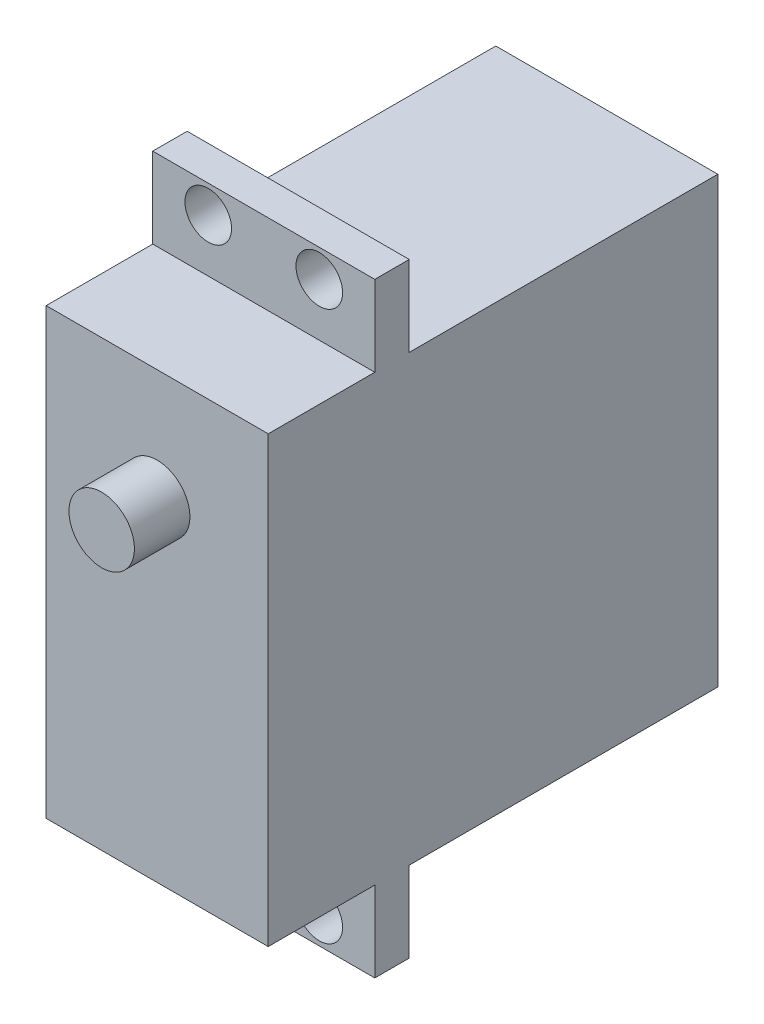
ISO-10303-21;
HEADER;
FILE_DESCRIPTION(('STEP AP214'),'2;1');
FILE_NAME('part.step','',(''),(''),'','','');
FILE_SCHEMA(('AUTOMOTIVE_DESIGN { 1 0 10303 214 1 1 1 1 }'));
ENDSEC;
DATA;
#1=APPLICATION_CONTEXT('core data for automotive mechanical design processes');
#2=APPLICATION_PROTOCOL_DEFINITION('international standard','automotive_design',2000,#1);
#3=PRODUCT_CONTEXT('',#1,'mechanical');
#4=PRODUCT('Part','Part','',(#3));
#5=PRODUCT_RELATED_PRODUCT_CATEGORY('part','',(#4));
#6=PRODUCT_DEFINITION_FORMATION('','',#4);
#7=PRODUCT_DEFINITION_CONTEXT('part definition',#1,'design');
#8=PRODUCT_DEFINITION('design','',#6,#7);
#9=PRODUCT_DEFINITION_SHAPE('','',#8);
#10=(LENGTH_UNIT() NAMED_UNIT(*) SI_UNIT(.MILLI.,.METRE.));
#11=(NAMED_UNIT(*) PLANE_ANGLE_UNIT() SI_UNIT($,.RADIAN.));
#12=(NAMED_UNIT(*) SI_UNIT($,.STERADIAN.) SOLID_ANGLE_UNIT());
#13=UNCERTAINTY_MEASURE_WITH_UNIT(LENGTH_MEASURE(1.E-05),#10,'distance_accuracy_value','');
#14=(GEOMETRIC_REPRESENTATION_CONTEXT(3) GLOBAL_UNCERTAINTY_ASSIGNED_CONTEXT((#13)) GLOBAL_UNIT_ASSIGNED_CONTEXT((#10,
#11,#12)) REPRESENTATION_CONTEXT('',''));
#15=CARTESIAN_POINT('',(0.,0.,0.));
#16=DIRECTION('',(0.,0.,1.));
#17=DIRECTION('',(1.,0.,0.));
#18=AXIS2_PLACEMENT_3D('',#15,#16,#17);
#19=CARTESIAN_POINT('',(10.,20.,20.25));
#20=DIRECTION('',(0.,-1.,0.));
#21=DIRECTION('',(0.,0.,-1.));
#22=AXIS2_PLACEMENT_3D('',#19,#20,#21);
#23=PLANE('',#22);
#24=DIRECTION('',(0.,0.,1.));
#25=VECTOR('',#24,1.);
#26=CARTESIAN_POINT('',(-10.,20.,20.25));
#27=LINE('',#26,#25);
#28=CARTESIAN_POINT('',(-10.,20.,-20.25));
#29=VERTEX_POINT('',#28);
#30=CARTESIAN_POINT('',(-10.,20.,7.55));
#31=VERTEX_POINT('',#30);
#32=EDGE_CURVE('E219',#29,#31,#27,.T.);
#33=ORIENTED_EDGE('',*,*,#32,.T.);
#34=DIRECTION('',(1.,0.,0.));
#35=VECTOR('',#34,1.);
#36=CARTESIAN_POINT('',(-10.,20.,7.55));
#37=LINE('',#36,#35);
#38=CARTESIAN_POINT('',(10.,20.,7.55));
#39=VERTEX_POINT('',#38);
#40=EDGE_CURVE('E152',#31,#39,#37,.T.);
#41=ORIENTED_EDGE('',*,*,#40,.T.);
#42=DIRECTION('',(0.,0.,1.));
#43=VECTOR('',#42,1.);
#44=CARTESIAN_POINT('',(10.,20.,20.25));
#45=LINE('',#44,#43);
#46=CARTESIAN_POINT('',(10.,20.,-20.25));
#47=VERTEX_POINT('',#46);
#48=EDGE_CURVE('E208',#47,#39,#45,.T.);
#49=ORIENTED_EDGE('',*,*,#48,.F.);
#50=DIRECTION('',(-1.,0.,0.));
#51=VECTOR('',#50,1.);
#52=CARTESIAN_POINT('',(10.,20.,-20.25));
#53=LINE('',#52,#51);
#54=EDGE_CURVE('E218',#47,#29,#53,.T.);
#55=ORIENTED_EDGE('',*,*,#54,.T.);
#56=EDGE_LOOP('',(#33,#41,#49,#55));
#57=FACE_BOUND('',#56,.T.);
#58=ADVANCED_FACE('F43',(#57),#23,.F.);
#59=CARTESIAN_POINT('',(10.,-20.,20.25));
#60=DIRECTION('',(0.,1.,0.));
#61=DIRECTION('',(0.,0.,1.));
#62=AXIS2_PLACEMENT_3D('',#59,#60,#61);
#63=PLANE('',#62);
#64=DIRECTION('',(-1.,0.,0.));
#65=VECTOR('',#64,1.);
#66=CARTESIAN_POINT('',(-10.,-20.,10.65));
#67=LINE('',#66,#65);
#68=CARTESIAN_POINT('',(10.,-20.,10.65));
#69=VERTEX_POINT('',#68);
#70=CARTESIAN_POINT('',(-10.,-20.,10.65));
#71=VERTEX_POINT('',#70);
#72=EDGE_CURVE('E68',#69,#71,#67,.T.);
#73=ORIENTED_EDGE('',*,*,#72,.F.);
#74=DIRECTION('',(0.,0.,-1.));
#75=VECTOR('',#74,1.);
#76=CARTESIAN_POINT('',(10.,-20.,20.25));
#77=LINE('',#76,#75);
#78=CARTESIAN_POINT('',(10.,-20.,20.25));
#79=VERTEX_POINT('',#78);
#80=EDGE_CURVE('E214',#79,#69,#77,.T.);
#81=ORIENTED_EDGE('',*,*,#80,.F.);
#82=DIRECTION('',(-1.,0.,0.));
#83=VECTOR('',#82,1.);
#84=CARTESIAN_POINT('',(10.,-20.,20.25));
#85=LINE('',#84,#83);
#86=CARTESIAN_POINT('',(-10.,-20.,20.25));
#87=VERTEX_POINT('',#86);
#88=EDGE_CURVE('E234',#79,#87,#85,.T.);
#89=ORIENTED_EDGE('',*,*,#88,.T.);
#90=DIRECTION('',(0.,0.,-1.));
#91=VECTOR('',#90,1.);
#92=CARTESIAN_POINT('',(-10.,-20.,20.25));
#93=LINE('',#92,#91);
#94=EDGE_CURVE('E226',#87,#71,#93,.T.);
#95=ORIENTED_EDGE('',*,*,#94,.T.);
#96=EDGE_LOOP('',(#73,#81,#89,#95));
#97=FACE_BOUND('',#96,.T.);
#98=ADVANCED_FACE('F272',(#97),#63,.F.);
#99=DIRECTION('',(1.,0.,0.));
#100=VECTOR('',#99,1.);
#101=CARTESIAN_POINT('',(-10.,-20.,7.55));
#102=LINE('',#101,#100);
#103=CARTESIAN_POINT('',(-10.,-20.,7.55));
#104=VERTEX_POINT('',#103);
#105=CARTESIAN_POINT('',(10.,-20.,7.55));
#106=VERTEX_POINT('',#105);
#107=EDGE_CURVE('E181',#104,#106,#102,.T.);
#108=ORIENTED_EDGE('',*,*,#107,.F.);
#109=CARTESIAN_POINT('',(-10.,-20.,-20.25));
#110=VERTEX_POINT('',#109);
#111=EDGE_CURVE('E223',#104,#110,#93,.T.);
#112=ORIENTED_EDGE('',*,*,#111,.T.);
#113=DIRECTION('',(-1.,0.,0.));
#114=VECTOR('',#113,1.);
#115=CARTESIAN_POINT('',(10.,-20.,-20.25));
#116=LINE('',#115,#114);
#117=CARTESIAN_POINT('',(10.,-20.,-20.25));
#118=VERTEX_POINT('',#117);
#119=EDGE_CURVE('E235',#118,#110,#116,.T.);
#120=ORIENTED_EDGE('',*,*,#119,.F.);
#121=EDGE_CURVE('E212',#106,#118,#77,.T.);
#122=ORIENTED_EDGE('',*,*,#121,.F.);
#123=EDGE_LOOP('',(#108,#112,#120,#122));
#124=FACE_BOUND('',#123,.T.);
#125=ADVANCED_FACE('F290',(#124),#63,.F.);
#126=CARTESIAN_POINT('',(10.,20.,10.65));
#127=VERTEX_POINT('',#126);
#128=CARTESIAN_POINT('',(10.,20.,20.25));
#129=VERTEX_POINT('',#128);
#130=EDGE_CURVE('E215',#127,#129,#45,.T.);
#131=ORIENTED_EDGE('',*,*,#130,.F.);
#132=DIRECTION('',(-1.,0.,0.));
#133=VECTOR('',#132,1.);
#134=CARTESIAN_POINT('',(-10.,20.,10.65));
#135=LINE('',#134,#133);
#136=CARTESIAN_POINT('',(-10.,20.,10.65));
#137=VERTEX_POINT('',#136);
#138=EDGE_CURVE('E163',#127,#137,#135,.T.);
#139=ORIENTED_EDGE('',*,*,#138,.T.);
#140=CARTESIAN_POINT('',(-10.,20.,20.25));
#141=VERTEX_POINT('',#140);
#142=EDGE_CURVE('E142',#137,#141,#27,.T.);
#143=ORIENTED_EDGE('',*,*,#142,.T.);
#144=DIRECTION('',(-1.,0.,0.));
#145=VECTOR('',#144,1.);
#146=CARTESIAN_POINT('',(10.,20.,20.25));
#147=LINE('',#146,#145);
#148=EDGE_CURVE('E55',#129,#141,#147,.T.);
#149=ORIENTED_EDGE('',*,*,#148,.F.);
#150=EDGE_LOOP('',(#131,#139,#143,#149));
#151=FACE_BOUND('',#150,.T.);
#152=ADVANCED_FACE('F44',(#151),#23,.F.);
#153=CARTESIAN_POINT('',(10.,-20.,20.25));
#154=DIRECTION('',(0.,0.,-1.));
#155=DIRECTION('',(-1.,0.,0.));
#156=AXIS2_PLACEMENT_3D('',#153,#154,#155);
#157=PLANE('',#156);
#158=CARTESIAN_POINT('',(0.,10.,20.25));
#159=DIRECTION('',(0.,0.,1.));
#160=DIRECTION('',(1.,0.,0.));
#161=AXIS2_PLACEMENT_3D('',#158,#159,#160);
#162=CIRCLE('',#161,2.95);
#163=CARTESIAN_POINT('',(2.95,10.,20.25));
#164=VERTEX_POINT('',#163);
#165=EDGE_CURVE('E11',#164,#164,#162,.T.);
#166=ORIENTED_EDGE('',*,*,#165,.F.);
#167=EDGE_LOOP('',(#166));
#168=FACE_BOUND('',#167,.T.);
#169=DIRECTION('',(0.,-1.,0.));
#170=VECTOR('',#169,1.);
#171=CARTESIAN_POINT('',(-10.,-20.,20.25));
#172=LINE('',#171,#170);
#173=EDGE_CURVE('E224',#141,#87,#172,.T.);
#174=ORIENTED_EDGE('',*,*,#173,.T.);
#175=ORIENTED_EDGE('',*,*,#88,.F.);
#176=DIRECTION('',(0.,-1.,0.));
#177=VECTOR('',#176,1.);
#178=CARTESIAN_POINT('',(10.,-20.,20.25));
#179=LINE('',#178,#177);
#180=EDGE_CURVE('E211',#129,#79,#179,.T.);
#181=ORIENTED_EDGE('',*,*,#180,.F.);
#182=ORIENTED_EDGE('',*,*,#148,.T.);
#183=EDGE_LOOP('',(#174,#175,#181,#182));
#184=FACE_BOUND('',#183,.T.);
#185=ADVANCED_FACE('F264',(#168,#184),#157,.F.);
#186=CARTESIAN_POINT('',(10.,-20.,-20.25));
#187=DIRECTION('',(0.,0.,1.));
#188=DIRECTION('',(1.,0.,0.));
#189=AXIS2_PLACEMENT_3D('',#186,#187,#188);
#190=PLANE('',#189);
#191=DIRECTION('',(0.,1.,0.));
#192=VECTOR('',#191,1.);
#193=CARTESIAN_POINT('',(-10.,-20.,-20.25));
#194=LINE('',#193,#192);
#195=EDGE_CURVE('E227',#110,#29,#194,.T.);
#196=ORIENTED_EDGE('',*,*,#195,.T.);
#197=ORIENTED_EDGE('',*,*,#54,.F.);
#198=DIRECTION('',(0.,1.,0.));
#199=VECTOR('',#198,1.);
#200=CARTESIAN_POINT('',(10.,-20.,-20.25));
#201=LINE('',#200,#199);
#202=EDGE_CURVE('E220',#118,#47,#201,.T.);
#203=ORIENTED_EDGE('',*,*,#202,.F.);
#204=ORIENTED_EDGE('',*,*,#119,.T.);
#205=EDGE_LOOP('',(#196,#197,#203,#204));
#206=FACE_BOUND('',#205,.T.);
#207=ADVANCED_FACE('F268',(#206),#190,.F.);
#208=CARTESIAN_POINT('',(10.,0.,0.));
#209=DIRECTION('',(1.,0.,0.));
#210=DIRECTION('',(0.,0.,-1.));
#211=AXIS2_PLACEMENT_3D('',#208,#209,#210);
#212=PLANE('',#211);
#213=ORIENTED_EDGE('',*,*,#48,.T.);
#214=DIRECTION('',(0.,-1.,0.));
#215=VECTOR('',#214,1.);
#216=CARTESIAN_POINT('',(10.,27.25,7.55));
#217=LINE('',#216,#215);
#218=CARTESIAN_POINT('',(10.,27.25,7.55));
#219=VERTEX_POINT('',#218);
#220=EDGE_CURVE('E166',#219,#39,#217,.T.);
#221=ORIENTED_EDGE('',*,*,#220,.F.);
#222=DIRECTION('',(0.,0.,1.));
#223=VECTOR('',#222,1.);
#224=CARTESIAN_POINT('',(10.,27.25,10.65));
#225=LINE('',#224,#223);
#226=CARTESIAN_POINT('',(10.,27.25,10.65));
#227=VERTEX_POINT('',#226);
#228=EDGE_CURVE('E160',#219,#227,#225,.T.);
#229=ORIENTED_EDGE('',*,*,#228,.T.);
#230=DIRECTION('',(0.,-1.,0.));
#231=VECTOR('',#230,1.);
#232=CARTESIAN_POINT('',(10.,27.25,10.65));
#233=LINE('',#232,#231);
#234=EDGE_CURVE('E145',#227,#127,#233,.T.);
#235=ORIENTED_EDGE('',*,*,#234,.T.);
#236=ORIENTED_EDGE('',*,*,#130,.T.);
#237=ORIENTED_EDGE('',*,*,#180,.T.);
#238=ORIENTED_EDGE('',*,*,#80,.T.);
#239=DIRECTION('',(0.,1.,0.));
#240=VECTOR('',#239,1.);
#241=CARTESIAN_POINT('',(10.,-27.25,10.65));
#242=LINE('',#241,#240);
#243=CARTESIAN_POINT('',(10.,-27.25,10.65));
#244=VERTEX_POINT('',#243);
#245=EDGE_CURVE('E200',#244,#69,#242,.T.);
#246=ORIENTED_EDGE('',*,*,#245,.F.);
#247=DIRECTION('',(0.,0.,1.));
#248=VECTOR('',#247,1.);
#249=CARTESIAN_POINT('',(10.,-27.25,10.65));
#250=LINE('',#249,#248);
#251=CARTESIAN_POINT('',(10.,-27.25,7.55));
#252=VERTEX_POINT('',#251);
#253=EDGE_CURVE('E188',#252,#244,#250,.T.);
#254=ORIENTED_EDGE('',*,*,#253,.F.);
#255=DIRECTION('',(0.,1.,0.));
#256=VECTOR('',#255,1.);
#257=CARTESIAN_POINT('',(10.,-27.25,7.55));
#258=LINE('',#257,#256);
#259=EDGE_CURVE('E205',#252,#106,#258,.T.);
#260=ORIENTED_EDGE('',*,*,#259,.T.);
#261=ORIENTED_EDGE('',*,*,#121,.T.);
#262=ORIENTED_EDGE('',*,*,#202,.T.);
#263=EDGE_LOOP('',(#213,#221,#229,#235,#236,#237,#238,#246,#254,#260,#261,#262));
#264=FACE_BOUND('',#263,.T.);
#265=ADVANCED_FACE('F282',(#264),#212,.T.);
#266=CARTESIAN_POINT('',(-10.,0.,0.));
#267=DIRECTION('',(1.,0.,0.));
#268=DIRECTION('',(0.,0.,-1.));
#269=AXIS2_PLACEMENT_3D('',#266,#267,#268);
#270=PLANE('',#269);
#271=ORIENTED_EDGE('',*,*,#32,.F.);
#272=ORIENTED_EDGE('',*,*,#195,.F.);
#273=ORIENTED_EDGE('',*,*,#111,.F.);
#274=DIRECTION('',(0.,1.,0.));
#275=VECTOR('',#274,1.);
#276=CARTESIAN_POINT('',(-10.,-27.25,7.55));
#277=LINE('',#276,#275);
#278=CARTESIAN_POINT('',(-10.,-27.25,7.55));
#279=VERTEX_POINT('',#278);
#280=EDGE_CURVE('E202',#279,#104,#277,.T.);
#281=ORIENTED_EDGE('',*,*,#280,.F.);
#282=DIRECTION('',(0.,0.,-1.));
#283=VECTOR('',#282,1.);
#284=CARTESIAN_POINT('',(-10.,-27.25,10.65));
#285=LINE('',#284,#283);
#286=CARTESIAN_POINT('',(-10.,-27.25,10.65));
#287=VERTEX_POINT('',#286);
#288=EDGE_CURVE('E184',#287,#279,#285,.T.);
#289=ORIENTED_EDGE('',*,*,#288,.F.);
#290=DIRECTION('',(0.,1.,0.));
#291=VECTOR('',#290,1.);
#292=CARTESIAN_POINT('',(-10.,-27.25,10.65));
#293=LINE('',#292,#291);
#294=EDGE_CURVE('E193',#287,#71,#293,.T.);
#295=ORIENTED_EDGE('',*,*,#294,.T.);
#296=ORIENTED_EDGE('',*,*,#94,.F.);
#297=ORIENTED_EDGE('',*,*,#173,.F.);
#298=ORIENTED_EDGE('',*,*,#142,.F.);
#299=DIRECTION('',(0.,-1.,0.));
#300=VECTOR('',#299,1.);
#301=CARTESIAN_POINT('',(-10.,27.25,10.65));
#302=LINE('',#301,#300);
#303=CARTESIAN_POINT('',(-10.,27.25,10.65));
#304=VERTEX_POINT('',#303);
#305=EDGE_CURVE('E58',#304,#137,#302,.T.);
#306=ORIENTED_EDGE('',*,*,#305,.F.);
#307=DIRECTION('',(0.,0.,-1.));
#308=VECTOR('',#307,1.);
#309=CARTESIAN_POINT('',(-10.,27.25,10.65));
#310=LINE('',#309,#308);
#311=CARTESIAN_POINT('',(-10.,27.25,7.55));
#312=VERTEX_POINT('',#311);
#313=EDGE_CURVE('E137',#304,#312,#310,.T.);
#314=ORIENTED_EDGE('',*,*,#313,.T.);
#315=DIRECTION('',(0.,-1.,0.));
#316=VECTOR('',#315,1.);
#317=CARTESIAN_POINT('',(-10.,27.25,7.55));
#318=LINE('',#317,#316);
#319=EDGE_CURVE('E162',#312,#31,#318,.T.);
#320=ORIENTED_EDGE('',*,*,#319,.T.);
#321=EDGE_LOOP('',(#271,#272,#273,#281,#289,#295,#296,#297,#298,#306,#314,#320));
#322=FACE_BOUND('',#321,.T.);
#323=ADVANCED_FACE('F138',(#322),#270,.F.);
#324=CARTESIAN_POINT('',(-10.,-27.25,7.55));
#325=DIRECTION('',(0.,0.,1.));
#326=DIRECTION('',(0.,-1.,0.));
#327=AXIS2_PLACEMENT_3D('',#324,#325,#326);
#328=PLANE('',#327);
#329=CARTESIAN_POINT('',(-5.,-24.75,7.55));
#330=DIRECTION('',(0.,0.,1.));
#331=DIRECTION('',(0.,-1.,0.));
#332=AXIS2_PLACEMENT_3D('',#329,#330,#331);
#333=CIRCLE('',#332,2.1);
#334=CARTESIAN_POINT('',(-5.,-26.85,7.55));
#335=VERTEX_POINT('',#334);
#336=EDGE_CURVE('E179',#335,#335,#333,.T.);
#337=ORIENTED_EDGE('',*,*,#336,.T.);
#338=EDGE_LOOP('',(#337));
#339=FACE_BOUND('',#338,.T.);
#340=CARTESIAN_POINT('',(5.,-24.75,7.55));
#341=DIRECTION('',(0.,0.,1.));
#342=DIRECTION('',(0.,-1.,0.));
#343=AXIS2_PLACEMENT_3D('',#340,#341,#342);
#344=CIRCLE('',#343,2.1);
#345=CARTESIAN_POINT('',(5.,-26.85,7.55));
#346=VERTEX_POINT('',#345);
#347=EDGE_CURVE('E174',#346,#346,#344,.T.);
#348=ORIENTED_EDGE('',*,*,#347,.T.);
#349=EDGE_LOOP('',(#348));
#350=FACE_BOUND('',#349,.T.);
#351=ORIENTED_EDGE('',*,*,#107,.T.);
#352=ORIENTED_EDGE('',*,*,#259,.F.);
#353=DIRECTION('',(1.,0.,0.));
#354=VECTOR('',#353,1.);
#355=CARTESIAN_POINT('',(-10.,-27.25,7.55));
#356=LINE('',#355,#354);
#357=EDGE_CURVE('E190',#279,#252,#356,.T.);
#358=ORIENTED_EDGE('',*,*,#357,.F.);
#359=ORIENTED_EDGE('',*,*,#280,.T.);
#360=EDGE_LOOP('',(#351,#352,#358,#359));
#361=FACE_BOUND('',#360,.T.);
#362=ADVANCED_FACE('F313',(#339,#350,#361),#328,.F.);
#363=CARTESIAN_POINT('',(-10.,-27.25,10.65));
#364=DIRECTION('',(0.,0.,-1.));
#365=DIRECTION('',(0.,1.,0.));
#366=AXIS2_PLACEMENT_3D('',#363,#364,#365);
#367=PLANE('',#366);
#368=CARTESIAN_POINT('',(-5.,-24.75,10.65));
#369=DIRECTION('',(0.,0.,1.));
#370=DIRECTION('',(1.,0.,0.));
#371=AXIS2_PLACEMENT_3D('',#368,#369,#370);
#372=CIRCLE('',#371,2.1);
#373=CARTESIAN_POINT('',(-2.9,-24.75,10.65));
#374=VERTEX_POINT('',#373);
#375=EDGE_CURVE('E175',#374,#374,#372,.T.);
#376=ORIENTED_EDGE('',*,*,#375,.F.);
#377=EDGE_LOOP('',(#376));
#378=FACE_BOUND('',#377,.T.);
#379=CARTESIAN_POINT('',(5.,-24.75,10.65));
#380=DIRECTION('',(0.,0.,1.));
#381=DIRECTION('',(1.,0.,0.));
#382=AXIS2_PLACEMENT_3D('',#379,#380,#381);
#383=CIRCLE('',#382,2.1);
#384=CARTESIAN_POINT('',(7.1,-24.75,10.65));
#385=VERTEX_POINT('',#384);
#386=EDGE_CURVE('E141',#385,#385,#383,.T.);
#387=ORIENTED_EDGE('',*,*,#386,.F.);
#388=EDGE_LOOP('',(#387));
#389=FACE_BOUND('',#388,.T.);
#390=ORIENTED_EDGE('',*,*,#72,.T.);
#391=ORIENTED_EDGE('',*,*,#294,.F.);
#392=DIRECTION('',(-1.,0.,0.));
#393=VECTOR('',#392,1.);
#394=CARTESIAN_POINT('',(-10.,-27.25,10.65));
#395=LINE('',#394,#393);
#396=EDGE_CURVE('E191',#244,#287,#395,.T.);
#397=ORIENTED_EDGE('',*,*,#396,.F.);
#398=ORIENTED_EDGE('',*,*,#245,.T.);
#399=EDGE_LOOP('',(#390,#391,#397,#398));
#400=FACE_BOUND('',#399,.T.);
#401=ADVANCED_FACE('F276',(#378,#389,#400),#367,.F.);
#402=CARTESIAN_POINT('',(0.,-27.25,0.));
#403=DIRECTION('',(0.,-1.,0.));
#404=DIRECTION('',(0.,0.,-1.));
#405=AXIS2_PLACEMENT_3D('',#402,#403,#404);
#406=PLANE('',#405);
#407=ORIENTED_EDGE('',*,*,#288,.T.);
#408=ORIENTED_EDGE('',*,*,#357,.T.);
#409=ORIENTED_EDGE('',*,*,#253,.T.);
#410=ORIENTED_EDGE('',*,*,#396,.T.);
#411=EDGE_LOOP('',(#407,#408,#409,#410));
#412=FACE_BOUND('',#411,.T.);
#413=ADVANCED_FACE('F314',(#412),#406,.T.);
#414=CARTESIAN_POINT('',(5.,-24.75,-20.25));
#415=DIRECTION('',(0.,0.,1.));
#416=DIRECTION('',(1.,0.,0.));
#417=AXIS2_PLACEMENT_3D('',#414,#415,#416);
#418=CYLINDRICAL_SURFACE('',#417,2.1);
#419=ORIENTED_EDGE('',*,*,#386,.T.);
#420=EDGE_LOOP('',(#419));
#421=FACE_BOUND('',#420,.T.);
#422=ORIENTED_EDGE('',*,*,#347,.F.);
#423=EDGE_LOOP('',(#422));
#424=FACE_BOUND('',#423,.T.);
#425=ADVANCED_FACE('F316',(#421,#424),#418,.F.);
#426=CARTESIAN_POINT('',(-5.,-24.75,-20.25));
#427=DIRECTION('',(0.,0.,1.));
#428=DIRECTION('',(1.,0.,0.));
#429=AXIS2_PLACEMENT_3D('',#426,#427,#428);
#430=CYLINDRICAL_SURFACE('',#429,2.1);
#431=ORIENTED_EDGE('',*,*,#375,.T.);
#432=EDGE_LOOP('',(#431));
#433=FACE_BOUND('',#432,.T.);
#434=ORIENTED_EDGE('',*,*,#336,.F.);
#435=EDGE_LOOP('',(#434));
#436=FACE_BOUND('',#435,.T.);
#437=ADVANCED_FACE('F325',(#433,#436),#430,.F.);
#438=CARTESIAN_POINT('',(-10.,27.25,10.65));
#439=DIRECTION('',(0.,0.,1.));
#440=DIRECTION('',(0.,-1.,0.));
#441=AXIS2_PLACEMENT_3D('',#438,#439,#440);
#442=PLANE('',#441);
#443=CARTESIAN_POINT('',(-5.,24.75,10.65));
#444=DIRECTION('',(0.,0.,-1.));
#445=DIRECTION('',(1.,0.,0.));
#446=AXIS2_PLACEMENT_3D('',#443,#444,#445);
#447=CIRCLE('',#446,2.1);
#448=CARTESIAN_POINT('',(-2.9,24.75,10.65));
#449=VERTEX_POINT('',#448);
#450=EDGE_CURVE('E241',#449,#449,#447,.T.);
#451=ORIENTED_EDGE('',*,*,#450,.T.);
#452=EDGE_LOOP('',(#451));
#453=FACE_BOUND('',#452,.T.);
#454=CARTESIAN_POINT('',(5.,24.75,10.65));
#455=DIRECTION('',(0.,0.,-1.));
#456=DIRECTION('',(1.,0.,0.));
#457=AXIS2_PLACEMENT_3D('',#454,#455,#456);
#458=CIRCLE('',#457,2.1);
#459=CARTESIAN_POINT('',(7.1,24.75,10.65));
#460=VERTEX_POINT('',#459);
#461=EDGE_CURVE('E246',#460,#460,#458,.T.);
#462=ORIENTED_EDGE('',*,*,#461,.T.);
#463=EDGE_LOOP('',(#462));
#464=FACE_BOUND('',#463,.T.);
#465=ORIENTED_EDGE('',*,*,#138,.F.);
#466=ORIENTED_EDGE('',*,*,#234,.F.);
#467=DIRECTION('',(-1.,0.,0.));
#468=VECTOR('',#467,1.);
#469=CARTESIAN_POINT('',(-10.,27.25,10.65));
#470=LINE('',#469,#468);
#471=EDGE_CURVE('E147',#227,#304,#470,.T.);
#472=ORIENTED_EDGE('',*,*,#471,.T.);
#473=ORIENTED_EDGE('',*,*,#305,.T.);
#474=EDGE_LOOP('',(#465,#466,#472,#473));
#475=FACE_BOUND('',#474,.T.);
#476=ADVANCED_FACE('F156',(#453,#464,#475),#442,.T.);
#477=CARTESIAN_POINT('',(-10.,27.25,7.55));
#478=DIRECTION('',(0.,0.,-1.));
#479=DIRECTION('',(0.,1.,0.));
#480=AXIS2_PLACEMENT_3D('',#477,#478,#479);
#481=PLANE('',#480);
#482=CARTESIAN_POINT('',(-5.,24.75,7.55));
#483=DIRECTION('',(0.,0.,-1.));
#484=DIRECTION('',(0.,1.,0.));
#485=AXIS2_PLACEMENT_3D('',#482,#483,#484);
#486=CIRCLE('',#485,2.1);
#487=CARTESIAN_POINT('',(-5.,26.85,7.55));
#488=VERTEX_POINT('',#487);
#489=EDGE_CURVE('E50',#488,#488,#486,.F.);
#490=ORIENTED_EDGE('',*,*,#489,.T.);
#491=EDGE_LOOP('',(#490));
#492=FACE_BOUND('',#491,.T.);
#493=CARTESIAN_POINT('',(5.,24.75,7.55));
#494=DIRECTION('',(0.,0.,-1.));
#495=DIRECTION('',(0.,1.,0.));
#496=AXIS2_PLACEMENT_3D('',#493,#494,#495);
#497=CIRCLE('',#496,2.1);
#498=CARTESIAN_POINT('',(5.,26.85,7.55));
#499=VERTEX_POINT('',#498);
#500=EDGE_CURVE('E239',#499,#499,#497,.F.);
#501=ORIENTED_EDGE('',*,*,#500,.T.);
#502=EDGE_LOOP('',(#501));
#503=FACE_BOUND('',#502,.T.);
#504=ORIENTED_EDGE('',*,*,#40,.F.);
#505=ORIENTED_EDGE('',*,*,#319,.F.);
#506=DIRECTION('',(1.,0.,0.));
#507=VECTOR('',#506,1.);
#508=CARTESIAN_POINT('',(-10.,27.25,7.55));
#509=LINE('',#508,#507);
#510=EDGE_CURVE('E153',#312,#219,#509,.T.);
#511=ORIENTED_EDGE('',*,*,#510,.T.);
#512=ORIENTED_EDGE('',*,*,#220,.T.);
#513=EDGE_LOOP('',(#504,#505,#511,#512));
#514=FACE_BOUND('',#513,.T.);
#515=ADVANCED_FACE('F308',(#492,#503,#514),#481,.T.);
#516=CARTESIAN_POINT('',(0.,27.25,0.));
#517=DIRECTION('',(0.,1.,0.));
#518=DIRECTION('',(0.,0.,-1.));
#519=AXIS2_PLACEMENT_3D('',#516,#517,#518);
#520=PLANE('',#519);
#521=ORIENTED_EDGE('',*,*,#313,.F.);
#522=ORIENTED_EDGE('',*,*,#471,.F.);
#523=ORIENTED_EDGE('',*,*,#228,.F.);
#524=ORIENTED_EDGE('',*,*,#510,.F.);
#525=EDGE_LOOP('',(#521,#522,#523,#524));
#526=FACE_BOUND('',#525,.T.);
#527=ADVANCED_FACE('F146',(#526),#520,.T.);
#528=CARTESIAN_POINT('',(5.,24.75,-20.25));
#529=DIRECTION('',(0.,0.,1.));
#530=DIRECTION('',(1.,0.,0.));
#531=AXIS2_PLACEMENT_3D('',#528,#529,#530);
#532=CYLINDRICAL_SURFACE('',#531,2.1);
#533=ORIENTED_EDGE('',*,*,#500,.F.);
#534=EDGE_LOOP('',(#533));
#535=FACE_BOUND('',#534,.T.);
#536=ORIENTED_EDGE('',*,*,#461,.F.);
#537=EDGE_LOOP('',(#536));
#538=FACE_BOUND('',#537,.T.);
#539=ADVANCED_FACE('F396',(#535,#538),#532,.F.);
#540=CARTESIAN_POINT('',(-5.,24.75,-20.25));
#541=DIRECTION('',(0.,0.,1.));
#542=DIRECTION('',(1.,0.,0.));
#543=AXIS2_PLACEMENT_3D('',#540,#541,#542);
#544=CYLINDRICAL_SURFACE('',#543,2.1);
#545=ORIENTED_EDGE('',*,*,#489,.F.);
#546=EDGE_LOOP('',(#545));
#547=FACE_BOUND('',#546,.T.);
#548=ORIENTED_EDGE('',*,*,#450,.F.);
#549=EDGE_LOOP('',(#548));
#550=FACE_BOUND('',#549,.T.);
#551=ADVANCED_FACE('F261',(#547,#550),#544,.F.);
#552=CARTESIAN_POINT('',(0.,10.,25.25));
#553=DIRECTION('',(0.,0.,-1.));
#554=DIRECTION('',(-1.,0.,0.));
#555=AXIS2_PLACEMENT_3D('',#552,#553,#554);
#556=CYLINDRICAL_SURFACE('',#555,2.95);
#557=CARTESIAN_POINT('',(0.,10.,25.25));
#558=DIRECTION('',(0.,0.,1.));
#559=DIRECTION('',(1.,0.,0.));
#560=AXIS2_PLACEMENT_3D('',#557,#558,#559);
#561=CIRCLE('',#560,2.95);
#562=CARTESIAN_POINT('',(2.95,10.,25.25));
#563=VERTEX_POINT('',#562);
#564=EDGE_CURVE('E253',#563,#563,#561,.T.);
#565=ORIENTED_EDGE('',*,*,#564,.F.);
#566=EDGE_LOOP('',(#565));
#567=FACE_BOUND('',#566,.T.);
#568=ORIENTED_EDGE('',*,*,#165,.T.);
#569=EDGE_LOOP('',(#568));
#570=FACE_BOUND('',#569,.T.);
#571=ADVANCED_FACE('F256',(#567,#570),#556,.T.);
#572=CARTESIAN_POINT('',(0.,10.,25.25));
#573=DIRECTION('',(0.,0.,1.));
#574=DIRECTION('',(1.,0.,0.));
#575=AXIS2_PLACEMENT_3D('',#572,#573,#574);
#576=PLANE('',#575);
#577=ORIENTED_EDGE('',*,*,#564,.T.);
#578=EDGE_LOOP('',(#577));
#579=FACE_BOUND('',#578,.T.);
#580=ADVANCED_FACE('F258',(#579),#576,.T.);
#581=CLOSED_SHELL('',(#58,#98,#125,#152,#185,#207,#265,#323,#362,#401,#413,#425,#437,#476,#515,
#527,#539,#551,#571,#580));
#582=MANIFOLD_SOLID_BREP('B2',#581);
#583=ADVANCED_BREP_SHAPE_REPRESENTATION('',(#18,#582),#14);
#584=SHAPE_DEFINITION_REPRESENTATION(#9,#583);
ENDSEC;
END-ISO-10303-21;
